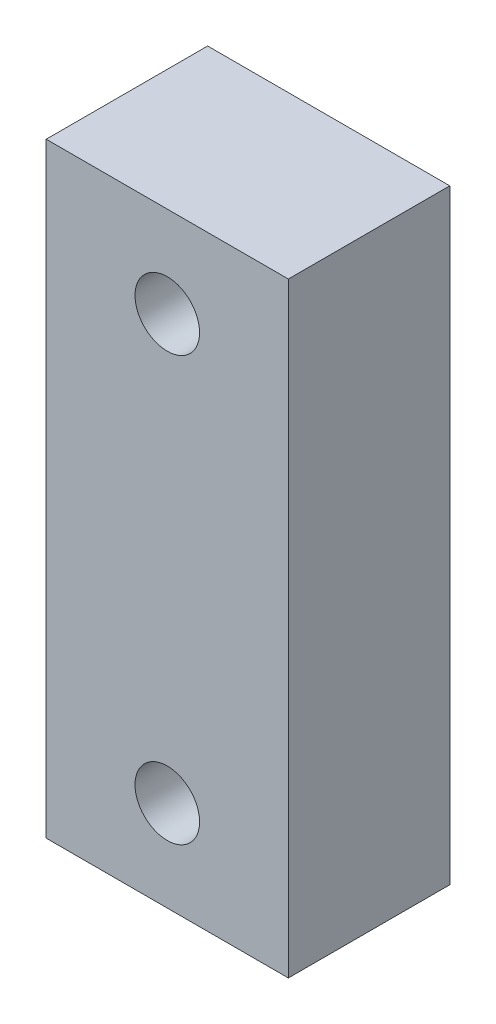
ISO-10303-21;
HEADER;
FILE_DESCRIPTION(('STEP AP214'),'2;1');
FILE_NAME('part.step','',(''),(''),'','','');
FILE_SCHEMA(('AUTOMOTIVE_DESIGN { 1 0 10303 214 1 1 1 1 }'));
ENDSEC;
DATA;
#1=APPLICATION_CONTEXT('core data for automotive mechanical design processes');
#2=APPLICATION_PROTOCOL_DEFINITION('international standard','automotive_design',2000,#1);
#3=PRODUCT_CONTEXT('',#1,'mechanical');
#4=PRODUCT('Part','Part','',(#3));
#5=PRODUCT_RELATED_PRODUCT_CATEGORY('part','',(#4));
#6=PRODUCT_DEFINITION_FORMATION('','',#4);
#7=PRODUCT_DEFINITION_CONTEXT('part definition',#1,'design');
#8=PRODUCT_DEFINITION('design','',#6,#7);
#9=PRODUCT_DEFINITION_SHAPE('','',#8);
#10=(LENGTH_UNIT() NAMED_UNIT(*) SI_UNIT(.MILLI.,.METRE.));
#11=(NAMED_UNIT(*) PLANE_ANGLE_UNIT() SI_UNIT($,.RADIAN.));
#12=(NAMED_UNIT(*) SI_UNIT($,.STERADIAN.) SOLID_ANGLE_UNIT());
#13=UNCERTAINTY_MEASURE_WITH_UNIT(LENGTH_MEASURE(1.E-05),#10,'distance_accuracy_value','');
#14=(GEOMETRIC_REPRESENTATION_CONTEXT(3) GLOBAL_UNCERTAINTY_ASSIGNED_CONTEXT((#13)) GLOBAL_UNIT_ASSIGNED_CONTEXT((#10,
#11,#12)) REPRESENTATION_CONTEXT('',''));
#15=CARTESIAN_POINT('',(0.,0.,0.));
#16=DIRECTION('',(0.,0.,1.));
#17=DIRECTION('',(1.,0.,0.));
#18=AXIS2_PLACEMENT_3D('',#15,#16,#17);
#19=CARTESIAN_POINT('',(0.,0.,20.));
#20=DIRECTION('',(0.,0.,-1.));
#21=DIRECTION('',(-1.,0.,0.));
#22=AXIS2_PLACEMENT_3D('',#19,#20,#21);
#23=PLANE('',#22);
#24=DIRECTION('',(0.,1.,0.));
#25=VECTOR('',#24,1.);
#26=CARTESIAN_POINT('',(15.,-37.5,20.));
#27=LINE('',#26,#25);
#28=CARTESIAN_POINT('',(15.,-37.5,20.));
#29=VERTEX_POINT('',#28);
#30=CARTESIAN_POINT('',(15.,37.5,20.));
#31=VERTEX_POINT('',#30);
#32=EDGE_CURVE('E89',#29,#31,#27,.T.);
#33=ORIENTED_EDGE('',*,*,#32,.T.);
#34=DIRECTION('',(-1.,0.,0.));
#35=VECTOR('',#34,1.);
#36=CARTESIAN_POINT('',(-15.,37.5,20.));
#37=LINE('',#36,#35);
#38=CARTESIAN_POINT('',(-15.,37.5,20.));
#39=VERTEX_POINT('',#38);
#40=EDGE_CURVE('E84',#31,#39,#37,.T.);
#41=ORIENTED_EDGE('',*,*,#40,.T.);
#42=DIRECTION('',(0.,-1.,0.));
#43=VECTOR('',#42,1.);
#44=CARTESIAN_POINT('',(-15.,-37.5,20.));
#45=LINE('',#44,#43);
#46=CARTESIAN_POINT('',(-15.,-37.5,20.));
#47=VERTEX_POINT('',#46);
#48=EDGE_CURVE('E87',#39,#47,#45,.T.);
#49=ORIENTED_EDGE('',*,*,#48,.T.);
#50=DIRECTION('',(1.,0.,0.));
#51=VECTOR('',#50,1.);
#52=CARTESIAN_POINT('',(-15.,-37.5,20.));
#53=LINE('',#52,#51);
#54=EDGE_CURVE('E54',#47,#29,#53,.T.);
#55=ORIENTED_EDGE('',*,*,#54,.T.);
#56=EDGE_LOOP('',(#33,#41,#49,#55));
#57=FACE_BOUND('',#56,.T.);
#58=CARTESIAN_POINT('',(0.,26.25,20.));
#59=DIRECTION('',(0.,0.,1.));
#60=DIRECTION('',(1.,0.,0.));
#61=AXIS2_PLACEMENT_3D('',#58,#59,#60);
#62=CIRCLE('',#61,4.);
#63=CARTESIAN_POINT('',(4.,26.25,20.));
#64=VERTEX_POINT('',#63);
#65=EDGE_CURVE('E104',#64,#64,#62,.T.);
#66=ORIENTED_EDGE('',*,*,#65,.F.);
#67=EDGE_LOOP('',(#66));
#68=FACE_BOUND('',#67,.T.);
#69=CARTESIAN_POINT('',(0.,-26.25,20.));
#70=DIRECTION('',(0.,0.,1.));
#71=DIRECTION('',(1.,0.,0.));
#72=AXIS2_PLACEMENT_3D('',#69,#70,#71);
#73=CIRCLE('',#72,4.);
#74=CARTESIAN_POINT('',(4.,-26.25,20.));
#75=VERTEX_POINT('',#74);
#76=EDGE_CURVE('E119',#75,#75,#73,.T.);
#77=ORIENTED_EDGE('',*,*,#76,.F.);
#78=EDGE_LOOP('',(#77));
#79=FACE_BOUND('',#78,.T.);
#80=ADVANCED_FACE('F37',(#57,#68,#79),#23,.F.);
#81=CARTESIAN_POINT('',(0.,0.,0.));
#82=DIRECTION('',(0.,0.,-1.));
#83=DIRECTION('',(-1.,0.,0.));
#84=AXIS2_PLACEMENT_3D('',#81,#82,#83);
#85=PLANE('',#84);
#86=CARTESIAN_POINT('',(0.,26.25,0.));
#87=DIRECTION('',(0.,0.,1.));
#88=DIRECTION('',(1.,0.,0.));
#89=AXIS2_PLACEMENT_3D('',#86,#87,#88);
#90=CIRCLE('',#89,4.);
#91=CARTESIAN_POINT('',(4.,26.25,0.));
#92=VERTEX_POINT('',#91);
#93=EDGE_CURVE('E116',#92,#92,#90,.T.);
#94=ORIENTED_EDGE('',*,*,#93,.T.);
#95=EDGE_LOOP('',(#94));
#96=FACE_BOUND('',#95,.T.);
#97=DIRECTION('',(0.,1.,0.));
#98=VECTOR('',#97,1.);
#99=CARTESIAN_POINT('',(15.,-37.5,0.));
#100=LINE('',#99,#98);
#101=CARTESIAN_POINT('',(15.,-37.5,0.));
#102=VERTEX_POINT('',#101);
#103=CARTESIAN_POINT('',(15.,37.5,0.));
#104=VERTEX_POINT('',#103);
#105=EDGE_CURVE('E101',#102,#104,#100,.T.);
#106=ORIENTED_EDGE('',*,*,#105,.F.);
#107=DIRECTION('',(1.,0.,0.));
#108=VECTOR('',#107,1.);
#109=CARTESIAN_POINT('',(-15.,-37.5,0.));
#110=LINE('',#109,#108);
#111=CARTESIAN_POINT('',(-15.,-37.5,0.));
#112=VERTEX_POINT('',#111);
#113=EDGE_CURVE('E77',#112,#102,#110,.T.);
#114=ORIENTED_EDGE('',*,*,#113,.F.);
#115=DIRECTION('',(0.,-1.,0.));
#116=VECTOR('',#115,1.);
#117=CARTESIAN_POINT('',(-15.,-37.5,0.));
#118=LINE('',#117,#116);
#119=CARTESIAN_POINT('',(-15.,37.5,0.));
#120=VERTEX_POINT('',#119);
#121=EDGE_CURVE('E71',#120,#112,#118,.T.);
#122=ORIENTED_EDGE('',*,*,#121,.F.);
#123=DIRECTION('',(-1.,0.,0.));
#124=VECTOR('',#123,1.);
#125=CARTESIAN_POINT('',(-15.,37.5,0.));
#126=LINE('',#125,#124);
#127=EDGE_CURVE('E93',#104,#120,#126,.T.);
#128=ORIENTED_EDGE('',*,*,#127,.F.);
#129=EDGE_LOOP('',(#106,#114,#122,#128));
#130=FACE_BOUND('',#129,.T.);
#131=CARTESIAN_POINT('',(0.,-26.25,0.));
#132=DIRECTION('',(0.,0.,1.));
#133=DIRECTION('',(1.,0.,0.));
#134=AXIS2_PLACEMENT_3D('',#131,#132,#133);
#135=CIRCLE('',#134,4.);
#136=CARTESIAN_POINT('',(4.,-26.25,0.));
#137=VERTEX_POINT('',#136);
#138=EDGE_CURVE('E122',#137,#137,#135,.T.);
#139=ORIENTED_EDGE('',*,*,#138,.T.);
#140=EDGE_LOOP('',(#139));
#141=FACE_BOUND('',#140,.T.);
#142=ADVANCED_FACE('F112',(#96,#130,#141),#85,.T.);
#143=CARTESIAN_POINT('',(15.,-37.5,20.));
#144=DIRECTION('',(-1.,0.,0.));
#145=DIRECTION('',(0.,0.,1.));
#146=AXIS2_PLACEMENT_3D('',#143,#144,#145);
#147=PLANE('',#146);
#148=ORIENTED_EDGE('',*,*,#105,.T.);
#149=DIRECTION('',(0.,0.,-1.));
#150=VECTOR('',#149,1.);
#151=CARTESIAN_POINT('',(15.,37.5,20.));
#152=LINE('',#151,#150);
#153=EDGE_CURVE('E11',#31,#104,#152,.T.);
#154=ORIENTED_EDGE('',*,*,#153,.F.);
#155=ORIENTED_EDGE('',*,*,#32,.F.);
#156=DIRECTION('',(0.,0.,-1.));
#157=VECTOR('',#156,1.);
#158=CARTESIAN_POINT('',(15.,-37.5,20.));
#159=LINE('',#158,#157);
#160=EDGE_CURVE('E97',#29,#102,#159,.T.);
#161=ORIENTED_EDGE('',*,*,#160,.T.);
#162=EDGE_LOOP('',(#148,#154,#155,#161));
#163=FACE_BOUND('',#162,.T.);
#164=ADVANCED_FACE('F39',(#163),#147,.F.);
#165=CARTESIAN_POINT('',(-15.,37.5,20.));
#166=DIRECTION('',(0.,-1.,0.));
#167=DIRECTION('',(0.,0.,-1.));
#168=AXIS2_PLACEMENT_3D('',#165,#166,#167);
#169=PLANE('',#168);
#170=ORIENTED_EDGE('',*,*,#127,.T.);
#171=DIRECTION('',(0.,0.,-1.));
#172=VECTOR('',#171,1.);
#173=CARTESIAN_POINT('',(-15.,37.5,20.));
#174=LINE('',#173,#172);
#175=EDGE_CURVE('E46',#39,#120,#174,.T.);
#176=ORIENTED_EDGE('',*,*,#175,.F.);
#177=ORIENTED_EDGE('',*,*,#40,.F.);
#178=ORIENTED_EDGE('',*,*,#153,.T.);
#179=EDGE_LOOP('',(#170,#176,#177,#178));
#180=FACE_BOUND('',#179,.T.);
#181=ADVANCED_FACE('F92',(#180),#169,.F.);
#182=CARTESIAN_POINT('',(-15.,-37.5,20.));
#183=DIRECTION('',(1.,0.,0.));
#184=DIRECTION('',(0.,0.,-1.));
#185=AXIS2_PLACEMENT_3D('',#182,#183,#184);
#186=PLANE('',#185);
#187=ORIENTED_EDGE('',*,*,#121,.T.);
#188=DIRECTION('',(0.,0.,-1.));
#189=VECTOR('',#188,1.);
#190=CARTESIAN_POINT('',(-15.,-37.5,20.));
#191=LINE('',#190,#189);
#192=EDGE_CURVE('E94',#47,#112,#191,.T.);
#193=ORIENTED_EDGE('',*,*,#192,.F.);
#194=ORIENTED_EDGE('',*,*,#48,.F.);
#195=ORIENTED_EDGE('',*,*,#175,.T.);
#196=EDGE_LOOP('',(#187,#193,#194,#195));
#197=FACE_BOUND('',#196,.T.);
#198=ADVANCED_FACE('F95',(#197),#186,.F.);
#199=CARTESIAN_POINT('',(-15.,-37.5,20.));
#200=DIRECTION('',(0.,1.,0.));
#201=DIRECTION('',(0.,0.,1.));
#202=AXIS2_PLACEMENT_3D('',#199,#200,#201);
#203=PLANE('',#202);
#204=ORIENTED_EDGE('',*,*,#113,.T.);
#205=ORIENTED_EDGE('',*,*,#160,.F.);
#206=ORIENTED_EDGE('',*,*,#54,.F.);
#207=ORIENTED_EDGE('',*,*,#192,.T.);
#208=EDGE_LOOP('',(#204,#205,#206,#207));
#209=FACE_BOUND('',#208,.T.);
#210=ADVANCED_FACE('F109',(#209),#203,.F.);
#211=CARTESIAN_POINT('',(0.,26.25,20.));
#212=DIRECTION('',(0.,0.,-1.));
#213=DIRECTION('',(-1.,0.,0.));
#214=AXIS2_PLACEMENT_3D('',#211,#212,#213);
#215=CYLINDRICAL_SURFACE('',#214,4.);
#216=ORIENTED_EDGE('',*,*,#65,.T.);
#217=EDGE_LOOP('',(#216));
#218=FACE_BOUND('',#217,.T.);
#219=ORIENTED_EDGE('',*,*,#93,.F.);
#220=EDGE_LOOP('',(#219));
#221=FACE_BOUND('',#220,.T.);
#222=ADVANCED_FACE('F139',(#218,#221),#215,.F.);
#223=CARTESIAN_POINT('',(0.,-26.25,20.));
#224=DIRECTION('',(0.,0.,-1.));
#225=DIRECTION('',(-1.,0.,0.));
#226=AXIS2_PLACEMENT_3D('',#223,#224,#225);
#227=CYLINDRICAL_SURFACE('',#226,4.);
#228=ORIENTED_EDGE('',*,*,#76,.T.);
#229=EDGE_LOOP('',(#228));
#230=FACE_BOUND('',#229,.T.);
#231=ORIENTED_EDGE('',*,*,#138,.F.);
#232=EDGE_LOOP('',(#231));
#233=FACE_BOUND('',#232,.T.);
#234=ADVANCED_FACE('F128',(#230,#233),#227,.F.);
#235=CLOSED_SHELL('',(#80,#142,#164,#181,#198,#210,#222,#234));
#236=MANIFOLD_SOLID_BREP('B2',#235);
#237=ADVANCED_BREP_SHAPE_REPRESENTATION('',(#18,#236),#14);
#238=SHAPE_DEFINITION_REPRESENTATION(#9,#237);
ENDSEC;
END-ISO-10303-21;
